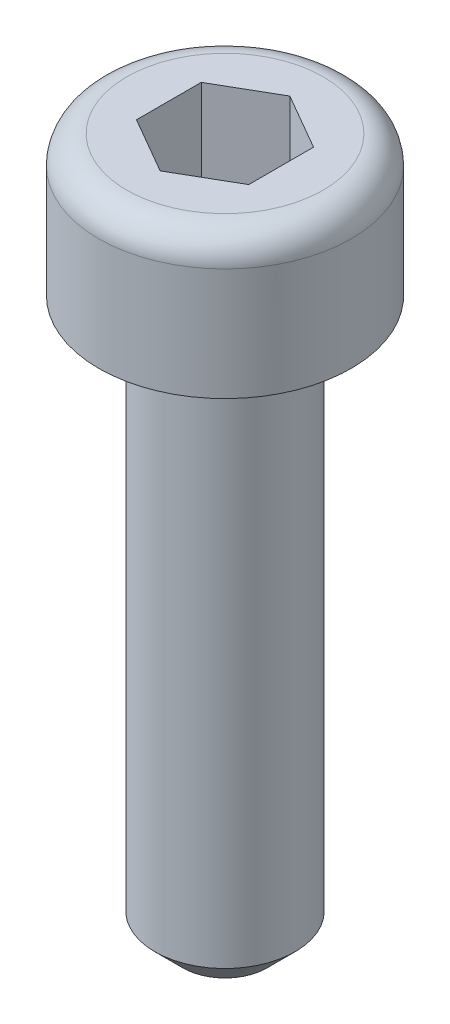
ISO-10303-21;
HEADER;
FILE_DESCRIPTION(('STEP AP214'),'2;1');
FILE_NAME('part.step','',(''),(''),'','','');
FILE_SCHEMA(('AUTOMOTIVE_DESIGN { 1 0 10303 214 1 1 1 1 }'));
ENDSEC;
DATA;
#1=APPLICATION_CONTEXT('core data for automotive mechanical design processes');
#2=APPLICATION_PROTOCOL_DEFINITION('international standard','automotive_design',2000,#1);
#3=PRODUCT_CONTEXT('',#1,'mechanical');
#4=PRODUCT('Part','Part','',(#3));
#5=PRODUCT_RELATED_PRODUCT_CATEGORY('part','',(#4));
#6=PRODUCT_DEFINITION_FORMATION('','',#4);
#7=PRODUCT_DEFINITION_CONTEXT('part definition',#1,'design');
#8=PRODUCT_DEFINITION('design','',#6,#7);
#9=PRODUCT_DEFINITION_SHAPE('','',#8);
#10=(LENGTH_UNIT() NAMED_UNIT(*) SI_UNIT(.MILLI.,.METRE.));
#11=(NAMED_UNIT(*) PLANE_ANGLE_UNIT() SI_UNIT($,.RADIAN.));
#12=(NAMED_UNIT(*) SI_UNIT($,.STERADIAN.) SOLID_ANGLE_UNIT());
#13=UNCERTAINTY_MEASURE_WITH_UNIT(LENGTH_MEASURE(1.E-05),#10,'distance_accuracy_value','');
#14=(GEOMETRIC_REPRESENTATION_CONTEXT(3) GLOBAL_UNCERTAINTY_ASSIGNED_CONTEXT((#13)) GLOBAL_UNIT_ASSIGNED_CONTEXT((#10,
#11,#12)) REPRESENTATION_CONTEXT('',''));
#15=CARTESIAN_POINT('',(0.,0.,0.));
#16=DIRECTION('',(0.,0.,1.));
#17=DIRECTION('',(1.,0.,0.));
#18=AXIS2_PLACEMENT_3D('',#15,#16,#17);
#19=CARTESIAN_POINT('',(0.,0.,0.));
#20=DIRECTION('',(0.,-1.,0.));
#21=DIRECTION('',(0.,0.,-1.));
#22=AXIS2_PLACEMENT_3D('',#19,#20,#21);
#23=PLANE('',#22);
#24=CARTESIAN_POINT('',(0.,0.,0.));
#25=DIRECTION('',(0.,-1.,0.));
#26=DIRECTION('',(0.,0.,-1.));
#27=AXIS2_PLACEMENT_3D('',#24,#25,#26);
#28=CIRCLE('',#27,1.75);
#29=CARTESIAN_POINT('',(0.,0.,-1.75));
#30=VERTEX_POINT('',#29);
#31=EDGE_CURVE('E43',#30,#30,#28,.F.);
#32=ORIENTED_EDGE('',*,*,#31,.T.);
#33=EDGE_LOOP('',(#32));
#34=FACE_BOUND('',#33,.T.);
#35=DIRECTION('',(-0.866025403784439,0.,-0.5));
#36=VECTOR('',#35,1.);
#37=CARTESIAN_POINT('',(1.,0.,-0.577350269189626));
#38=LINE('',#37,#36);
#39=CARTESIAN_POINT('',(1.,0.,-0.577350269189626));
#40=VERTEX_POINT('',#39);
#41=CARTESIAN_POINT('',(0.,0.,-1.15470053837925));
#42=VERTEX_POINT('',#41);
#43=EDGE_CURVE('E124',#40,#42,#38,.T.);
#44=ORIENTED_EDGE('',*,*,#43,.F.);
#45=DIRECTION('',(0.,0.,-1.));
#46=VECTOR('',#45,1.);
#47=CARTESIAN_POINT('',(1.,0.,0.577350269189626));
#48=LINE('',#47,#46);
#49=CARTESIAN_POINT('',(1.,0.,0.577350269189626));
#50=VERTEX_POINT('',#49);
#51=EDGE_CURVE('E50',#50,#40,#48,.T.);
#52=ORIENTED_EDGE('',*,*,#51,.F.);
#53=DIRECTION('',(0.866025403784439,0.,-0.5));
#54=VECTOR('',#53,1.);
#55=CARTESIAN_POINT('',(0.,0.,1.15470053837925));
#56=LINE('',#55,#54);
#57=CARTESIAN_POINT('',(0.,0.,1.15470053837925));
#58=VERTEX_POINT('',#57);
#59=EDGE_CURVE('E133',#58,#50,#56,.T.);
#60=ORIENTED_EDGE('',*,*,#59,.F.);
#61=DIRECTION('',(0.866025403784438,0.,0.5));
#62=VECTOR('',#61,1.);
#63=CARTESIAN_POINT('',(-0.999999999999999,0.,0.577350269189626));
#64=LINE('',#63,#62);
#65=CARTESIAN_POINT('',(-0.999999999999999,0.,0.577350269189626));
#66=VERTEX_POINT('',#65);
#67=EDGE_CURVE('E131',#66,#58,#64,.T.);
#68=ORIENTED_EDGE('',*,*,#67,.F.);
#69=DIRECTION('',(0.,0.,1.));
#70=VECTOR('',#69,1.);
#71=CARTESIAN_POINT('',(-0.999999999999999,0.,-0.577350269189626));
#72=LINE('',#71,#70);
#73=CARTESIAN_POINT('',(-0.999999999999999,0.,-0.577350269189626));
#74=VERTEX_POINT('',#73);
#75=EDGE_CURVE('E98',#74,#66,#72,.T.);
#76=ORIENTED_EDGE('',*,*,#75,.F.);
#77=DIRECTION('',(-0.866025403784439,0.,0.5));
#78=VECTOR('',#77,1.);
#79=CARTESIAN_POINT('',(0.,0.,-1.15470053837925));
#80=LINE('',#79,#78);
#81=EDGE_CURVE('E127',#42,#74,#80,.T.);
#82=ORIENTED_EDGE('',*,*,#81,.F.);
#83=EDGE_LOOP('',(#44,#52,#60,#68,#76,#82));
#84=FACE_BOUND('',#83,.T.);
#85=ADVANCED_FACE('F35',(#34,#84),#23,.F.);
#86=CARTESIAN_POINT('',(0.,0.,0.));
#87=DIRECTION('',(0.,1.,0.));
#88=DIRECTION('',(0.,0.,1.));
#89=AXIS2_PLACEMENT_3D('',#86,#87,#88);
#90=CYLINDRICAL_SURFACE('',#89,2.25);
#91=CARTESIAN_POINT('',(0.,-0.5,0.));
#92=DIRECTION('',(0.,-1.,0.));
#93=DIRECTION('',(0.,0.,-1.));
#94=AXIS2_PLACEMENT_3D('',#91,#92,#93);
#95=CIRCLE('',#94,2.25);
#96=CARTESIAN_POINT('',(0.,-0.5,-2.25));
#97=VERTEX_POINT('',#96);
#98=EDGE_CURVE('E11',#97,#97,#95,.T.);
#99=ORIENTED_EDGE('',*,*,#98,.T.);
#100=EDGE_LOOP('',(#99));
#101=FACE_BOUND('',#100,.T.);
#102=CARTESIAN_POINT('',(0.,-2.5,0.));
#103=DIRECTION('',(0.,1.,0.));
#104=DIRECTION('',(0.,0.,1.));
#105=AXIS2_PLACEMENT_3D('',#102,#103,#104);
#106=CIRCLE('',#105,2.25);
#107=CARTESIAN_POINT('',(0.,-2.5,2.25));
#108=VERTEX_POINT('',#107);
#109=EDGE_CURVE('E145',#108,#108,#106,.T.);
#110=ORIENTED_EDGE('',*,*,#109,.T.);
#111=EDGE_LOOP('',(#110));
#112=FACE_BOUND('',#111,.T.);
#113=ADVANCED_FACE('F167',(#101,#112),#90,.T.);
#114=CARTESIAN_POINT('',(2.25,-2.5,0.));
#115=DIRECTION('',(0.,1.,0.));
#116=DIRECTION('',(0.,0.,1.));
#117=AXIS2_PLACEMENT_3D('',#114,#115,#116);
#118=PLANE('',#117);
#119=ORIENTED_EDGE('',*,*,#109,.F.);
#120=EDGE_LOOP('',(#119));
#121=FACE_BOUND('',#120,.T.);
#122=CARTESIAN_POINT('',(0.,-2.5,0.));
#123=DIRECTION('',(0.,1.,0.));
#124=DIRECTION('',(0.,0.,1.));
#125=AXIS2_PLACEMENT_3D('',#122,#123,#124);
#126=CIRCLE('',#125,1.25);
#127=CARTESIAN_POINT('',(0.,-2.5,1.25));
#128=VERTEX_POINT('',#127);
#129=EDGE_CURVE('E137',#128,#128,#126,.T.);
#130=ORIENTED_EDGE('',*,*,#129,.T.);
#131=EDGE_LOOP('',(#130));
#132=FACE_BOUND('',#131,.T.);
#133=ADVANCED_FACE('F172',(#121,#132),#118,.F.);
#134=CARTESIAN_POINT('',(0.,0.,0.));
#135=DIRECTION('',(0.,1.,0.));
#136=DIRECTION('',(0.,0.,1.));
#137=AXIS2_PLACEMENT_3D('',#134,#135,#136);
#138=CYLINDRICAL_SURFACE('',#137,1.25);
#139=CARTESIAN_POINT('',(0.,-12.,0.));
#140=DIRECTION('',(0.,1.,0.));
#141=DIRECTION('',(0.,0.,1.));
#142=AXIS2_PLACEMENT_3D('',#139,#140,#141);
#143=CIRCLE('',#142,1.25);
#144=CARTESIAN_POINT('',(0.,-12.,1.25));
#145=VERTEX_POINT('',#144);
#146=EDGE_CURVE('E148',#145,#145,#143,.T.);
#147=ORIENTED_EDGE('',*,*,#146,.T.);
#148=EDGE_LOOP('',(#147));
#149=FACE_BOUND('',#148,.T.);
#150=ORIENTED_EDGE('',*,*,#129,.F.);
#151=EDGE_LOOP('',(#150));
#152=FACE_BOUND('',#151,.T.);
#153=ADVANCED_FACE('F178',(#149,#152),#138,.T.);
#154=CARTESIAN_POINT('',(1.25,-12.5,0.));
#155=DIRECTION('',(0.,1.,0.));
#156=DIRECTION('',(0.,0.,1.));
#157=AXIS2_PLACEMENT_3D('',#154,#155,#156);
#158=PLANE('',#157);
#159=CARTESIAN_POINT('',(0.,-12.5,0.));
#160=DIRECTION('',(0.,1.,0.));
#161=DIRECTION('',(0.,0.,1.));
#162=AXIS2_PLACEMENT_3D('',#159,#160,#161);
#163=CIRCLE('',#162,0.750000000000002);
#164=CARTESIAN_POINT('',(0.,-12.5,0.750000000000002));
#165=VERTEX_POINT('',#164);
#166=EDGE_CURVE('E151',#165,#165,#163,.F.);
#167=ORIENTED_EDGE('',*,*,#166,.T.);
#168=EDGE_LOOP('',(#167));
#169=FACE_BOUND('',#168,.T.);
#170=ADVANCED_FACE('F182',(#169),#158,.F.);
#171=CARTESIAN_POINT('',(1.,-2.,0.577350269189626));
#172=DIRECTION('',(1.,0.,0.));
#173=DIRECTION('',(0.,0.,-1.));
#174=AXIS2_PLACEMENT_3D('',#171,#172,#173);
#175=PLANE('',#174);
#176=ORIENTED_EDGE('',*,*,#51,.T.);
#177=DIRECTION('',(0.,1.,0.));
#178=VECTOR('',#177,1.);
#179=CARTESIAN_POINT('',(1.,-2.,-0.577350269189626));
#180=LINE('',#179,#178);
#181=CARTESIAN_POINT('',(1.,-2.,-0.577350269189626));
#182=VERTEX_POINT('',#181);
#183=EDGE_CURVE('E80',#182,#40,#180,.T.);
#184=ORIENTED_EDGE('',*,*,#183,.F.);
#185=DIRECTION('',(0.,0.,-1.));
#186=VECTOR('',#185,1.);
#187=CARTESIAN_POINT('',(1.,-2.,0.577350269189626));
#188=LINE('',#187,#186);
#189=CARTESIAN_POINT('',(1.,-2.,0.577350269189626));
#190=VERTEX_POINT('',#189);
#191=EDGE_CURVE('E135',#190,#182,#188,.T.);
#192=ORIENTED_EDGE('',*,*,#191,.F.);
#193=DIRECTION('',(0.,1.,0.));
#194=VECTOR('',#193,1.);
#195=CARTESIAN_POINT('',(1.,-2.,0.577350269189626));
#196=LINE('',#195,#194);
#197=EDGE_CURVE('E58',#190,#50,#196,.T.);
#198=ORIENTED_EDGE('',*,*,#197,.T.);
#199=EDGE_LOOP('',(#176,#184,#192,#198));
#200=FACE_BOUND('',#199,.T.);
#201=ADVANCED_FACE('F186',(#200),#175,.F.);
#202=CARTESIAN_POINT('',(0.,-2.,1.15470053837925));
#203=DIRECTION('',(0.5,0.,0.866025403784439));
#204=DIRECTION('',(0.866025403784439,0.,-0.5));
#205=AXIS2_PLACEMENT_3D('',#202,#203,#204);
#206=PLANE('',#205);
#207=ORIENTED_EDGE('',*,*,#59,.T.);
#208=ORIENTED_EDGE('',*,*,#197,.F.);
#209=DIRECTION('',(0.866025403784439,0.,-0.5));
#210=VECTOR('',#209,1.);
#211=CARTESIAN_POINT('',(0.,-2.,1.15470053837925));
#212=LINE('',#211,#210);
#213=CARTESIAN_POINT('',(0.,-2.,1.15470053837925));
#214=VERTEX_POINT('',#213);
#215=EDGE_CURVE('E110',#214,#190,#212,.T.);
#216=ORIENTED_EDGE('',*,*,#215,.F.);
#217=DIRECTION('',(0.,1.,0.));
#218=VECTOR('',#217,1.);
#219=CARTESIAN_POINT('',(0.,-2.,1.15470053837925));
#220=LINE('',#219,#218);
#221=EDGE_CURVE('E102',#214,#58,#220,.T.);
#222=ORIENTED_EDGE('',*,*,#221,.T.);
#223=EDGE_LOOP('',(#207,#208,#216,#222));
#224=FACE_BOUND('',#223,.T.);
#225=ADVANCED_FACE('F190',(#224),#206,.F.);
#226=CARTESIAN_POINT('',(-0.999999999999999,-2.,0.577350269189626));
#227=DIRECTION('',(-0.5,0.,0.866025403784439));
#228=DIRECTION('',(0.866025403784438,0.,0.5));
#229=AXIS2_PLACEMENT_3D('',#226,#227,#228);
#230=PLANE('',#229);
#231=ORIENTED_EDGE('',*,*,#67,.T.);
#232=ORIENTED_EDGE('',*,*,#221,.F.);
#233=DIRECTION('',(0.866025403784438,0.,0.5));
#234=VECTOR('',#233,1.);
#235=CARTESIAN_POINT('',(-0.999999999999999,-2.,0.577350269189626));
#236=LINE('',#235,#234);
#237=CARTESIAN_POINT('',(-0.999999999999999,-2.,0.577350269189626));
#238=VERTEX_POINT('',#237);
#239=EDGE_CURVE('E106',#238,#214,#236,.T.);
#240=ORIENTED_EDGE('',*,*,#239,.F.);
#241=DIRECTION('',(0.,1.,0.));
#242=VECTOR('',#241,1.);
#243=CARTESIAN_POINT('',(-0.999999999999999,-2.,0.577350269189626));
#244=LINE('',#243,#242);
#245=EDGE_CURVE('E91',#238,#66,#244,.T.);
#246=ORIENTED_EDGE('',*,*,#245,.T.);
#247=EDGE_LOOP('',(#231,#232,#240,#246));
#248=FACE_BOUND('',#247,.T.);
#249=ADVANCED_FACE('F107',(#248),#230,.F.);
#250=CARTESIAN_POINT('',(-0.999999999999999,-2.,-0.577350269189626));
#251=DIRECTION('',(-1.,0.,0.));
#252=DIRECTION('',(0.,0.,1.));
#253=AXIS2_PLACEMENT_3D('',#250,#251,#252);
#254=PLANE('',#253);
#255=ORIENTED_EDGE('',*,*,#75,.T.);
#256=ORIENTED_EDGE('',*,*,#245,.F.);
#257=DIRECTION('',(0.,0.,1.));
#258=VECTOR('',#257,1.);
#259=CARTESIAN_POINT('',(-0.999999999999999,-2.,-0.577350269189626));
#260=LINE('',#259,#258);
#261=CARTESIAN_POINT('',(-0.999999999999999,-2.,-0.577350269189626));
#262=VERTEX_POINT('',#261);
#263=EDGE_CURVE('E95',#262,#238,#260,.T.);
#264=ORIENTED_EDGE('',*,*,#263,.F.);
#265=DIRECTION('',(0.,1.,0.));
#266=VECTOR('',#265,1.);
#267=CARTESIAN_POINT('',(-0.999999999999999,-2.,-0.577350269189626));
#268=LINE('',#267,#266);
#269=EDGE_CURVE('E103',#262,#74,#268,.T.);
#270=ORIENTED_EDGE('',*,*,#269,.T.);
#271=EDGE_LOOP('',(#255,#256,#264,#270));
#272=FACE_BOUND('',#271,.T.);
#273=ADVANCED_FACE('F93',(#272),#254,.F.);
#274=CARTESIAN_POINT('',(0.,-2.,-1.15470053837925));
#275=DIRECTION('',(-0.5,0.,-0.866025403784439));
#276=DIRECTION('',(-0.866025403784439,0.,0.5));
#277=AXIS2_PLACEMENT_3D('',#274,#275,#276);
#278=PLANE('',#277);
#279=ORIENTED_EDGE('',*,*,#81,.T.);
#280=ORIENTED_EDGE('',*,*,#269,.F.);
#281=DIRECTION('',(-0.866025403784439,0.,0.5));
#282=VECTOR('',#281,1.);
#283=CARTESIAN_POINT('',(0.,-2.,-1.15470053837925));
#284=LINE('',#283,#282);
#285=CARTESIAN_POINT('',(0.,-2.,-1.15470053837925));
#286=VERTEX_POINT('',#285);
#287=EDGE_CURVE('E116',#286,#262,#284,.T.);
#288=ORIENTED_EDGE('',*,*,#287,.F.);
#289=DIRECTION('',(0.,1.,0.));
#290=VECTOR('',#289,1.);
#291=CARTESIAN_POINT('',(0.,-2.,-1.15470053837925));
#292=LINE('',#291,#290);
#293=EDGE_CURVE('E140',#286,#42,#292,.T.);
#294=ORIENTED_EDGE('',*,*,#293,.T.);
#295=EDGE_LOOP('',(#279,#280,#288,#294));
#296=FACE_BOUND('',#295,.T.);
#297=ADVANCED_FACE('F194',(#296),#278,.F.);
#298=CARTESIAN_POINT('',(1.,-2.,-0.577350269189626));
#299=DIRECTION('',(0.5,0.,-0.866025403784439));
#300=DIRECTION('',(-0.866025403784439,0.,-0.5));
#301=AXIS2_PLACEMENT_3D('',#298,#299,#300);
#302=PLANE('',#301);
#303=ORIENTED_EDGE('',*,*,#43,.T.);
#304=ORIENTED_EDGE('',*,*,#293,.F.);
#305=DIRECTION('',(-0.866025403784439,0.,-0.5));
#306=VECTOR('',#305,1.);
#307=CARTESIAN_POINT('',(1.,-2.,-0.577350269189626));
#308=LINE('',#307,#306);
#309=EDGE_CURVE('E118',#182,#286,#308,.T.);
#310=ORIENTED_EDGE('',*,*,#309,.F.);
#311=ORIENTED_EDGE('',*,*,#183,.T.);
#312=EDGE_LOOP('',(#303,#304,#310,#311));
#313=FACE_BOUND('',#312,.T.);
#314=ADVANCED_FACE('F191',(#313),#302,.F.);
#315=CARTESIAN_POINT('',(1.,-2.,-0.577350269189626));
#316=DIRECTION('',(0.,1.,0.));
#317=DIRECTION('',(0.,0.,1.));
#318=AXIS2_PLACEMENT_3D('',#315,#316,#317);
#319=PLANE('',#318);
#320=ORIENTED_EDGE('',*,*,#191,.T.);
#321=ORIENTED_EDGE('',*,*,#309,.T.);
#322=ORIENTED_EDGE('',*,*,#287,.T.);
#323=ORIENTED_EDGE('',*,*,#263,.T.);
#324=ORIENTED_EDGE('',*,*,#239,.T.);
#325=ORIENTED_EDGE('',*,*,#215,.T.);
#326=EDGE_LOOP('',(#320,#321,#322,#323,#324,#325));
#327=FACE_BOUND('',#326,.T.);
#328=ADVANCED_FACE('F113',(#327),#319,.T.);
#329=CARTESIAN_POINT('',(0.,-12.,0.));
#330=DIRECTION('',(0.,1.,0.));
#331=DIRECTION('',(0.,0.,1.));
#332=AXIS2_PLACEMENT_3D('',#329,#330,#331);
#333=CONICAL_SURFACE('',#332,1.25,0.78539816339745);
#334=ORIENTED_EDGE('',*,*,#166,.F.);
#335=EDGE_LOOP('',(#334));
#336=FACE_BOUND('',#335,.T.);
#337=ORIENTED_EDGE('',*,*,#146,.F.);
#338=EDGE_LOOP('',(#337));
#339=FACE_BOUND('',#338,.T.);
#340=ADVANCED_FACE('F159',(#336,#339),#333,.T.);
#341=CARTESIAN_POINT('',(0.,-0.5,0.));
#342=DIRECTION('',(0.,-1.,0.));
#343=DIRECTION('',(0.,0.,-1.));
#344=AXIS2_PLACEMENT_3D('',#341,#342,#343);
#345=TOROIDAL_SURFACE('',#344,1.75,0.5);
#346=ORIENTED_EDGE('',*,*,#98,.F.);
#347=EDGE_LOOP('',(#346));
#348=FACE_BOUND('',#347,.T.);
#349=ORIENTED_EDGE('',*,*,#31,.F.);
#350=EDGE_LOOP('',(#349));
#351=FACE_BOUND('',#350,.T.);
#352=ADVANCED_FACE('F37',(#348,#351),#345,.T.);
#353=CLOSED_SHELL('',(#85,#113,#133,#153,#170,#201,#225,#249,#273,#297,#314,#328,#340,#352));
#354=MANIFOLD_SOLID_BREP('B2',#353);
#355=ADVANCED_BREP_SHAPE_REPRESENTATION('',(#18,#354),#14);
#356=SHAPE_DEFINITION_REPRESENTATION(#9,#355);
ENDSEC;
END-ISO-10303-21;
